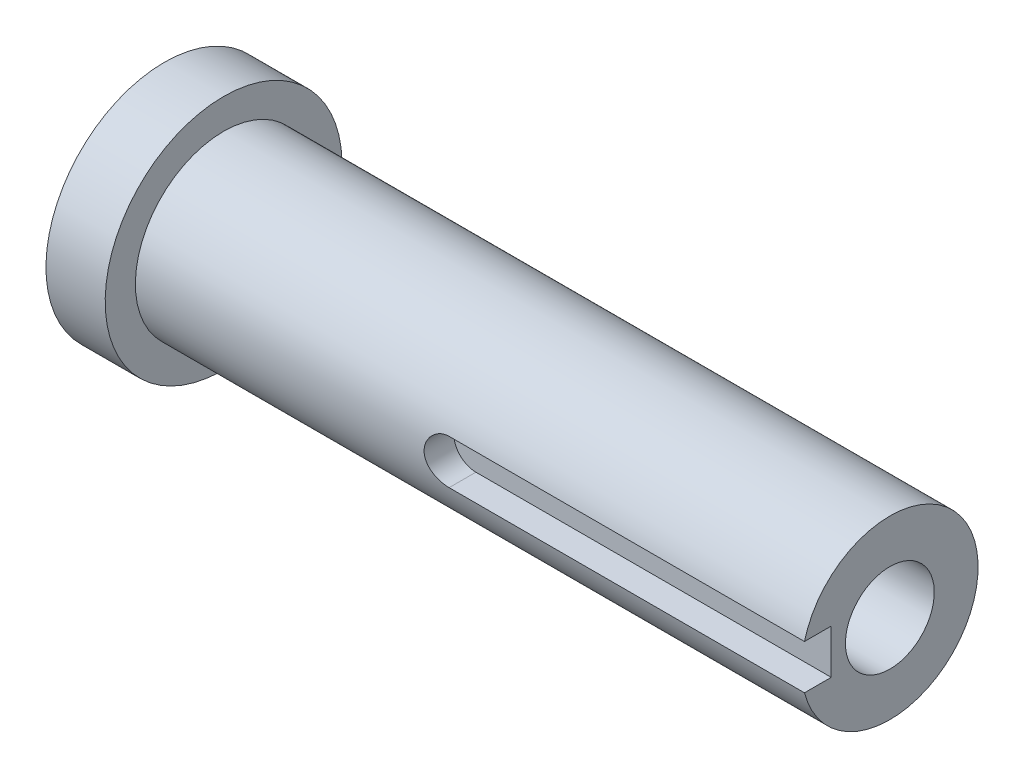
ISO-10303-21;
HEADER;
FILE_DESCRIPTION(('STEP AP214'),'2;1');
FILE_NAME('part.step','',(''),(''),'','','');
FILE_SCHEMA(('AUTOMOTIVE_DESIGN { 1 0 10303 214 1 1 1 1 }'));
ENDSEC;
DATA;
#1=APPLICATION_CONTEXT('core data for automotive mechanical design processes');
#2=APPLICATION_PROTOCOL_DEFINITION('international standard','automotive_design',2000,#1);
#3=PRODUCT_CONTEXT('',#1,'mechanical');
#4=PRODUCT('Part','Part','',(#3));
#5=PRODUCT_RELATED_PRODUCT_CATEGORY('part','',(#4));
#6=PRODUCT_DEFINITION_FORMATION('','',#4);
#7=PRODUCT_DEFINITION_CONTEXT('part definition',#1,'design');
#8=PRODUCT_DEFINITION('design','',#6,#7);
#9=PRODUCT_DEFINITION_SHAPE('','',#8);
#10=(LENGTH_UNIT() NAMED_UNIT(*) SI_UNIT(.MILLI.,.METRE.));
#11=(NAMED_UNIT(*) PLANE_ANGLE_UNIT() SI_UNIT($,.RADIAN.));
#12=(NAMED_UNIT(*) SI_UNIT($,.STERADIAN.) SOLID_ANGLE_UNIT());
#13=UNCERTAINTY_MEASURE_WITH_UNIT(LENGTH_MEASURE(1.E-05),#10,'distance_accuracy_value','');
#14=(GEOMETRIC_REPRESENTATION_CONTEXT(3) GLOBAL_UNCERTAINTY_ASSIGNED_CONTEXT((#13)) GLOBAL_UNIT_ASSIGNED_CONTEXT((#10,
#11,#12)) REPRESENTATION_CONTEXT('',''));
#15=CARTESIAN_POINT('',(0.,0.,0.));
#16=DIRECTION('',(0.,0.,1.));
#17=DIRECTION('',(1.,0.,0.));
#18=AXIS2_PLACEMENT_3D('',#15,#16,#17);
#19=CARTESIAN_POINT('',(155.575,0.,0.));
#20=DIRECTION('',(-1.,0.,0.));
#21=DIRECTION('',(0.,-1.,0.));
#22=AXIS2_PLACEMENT_3D('',#19,#20,#21);
#23=PLANE('',#22);
#24=CARTESIAN_POINT('',(155.575,0.,0.));
#25=DIRECTION('',(-1.,0.,0.));
#26=DIRECTION('',(0.,-1.,0.));
#27=AXIS2_PLACEMENT_3D('',#24,#25,#26);
#28=CIRCLE('',#27,9.525);
#29=CARTESIAN_POINT('',(155.575,-9.525,0.));
#30=VERTEX_POINT('',#29);
#31=EDGE_CURVE('E89',#30,#30,#28,.T.);
#32=ORIENTED_EDGE('',*,*,#31,.T.);
#33=EDGE_LOOP('',(#32));
#34=FACE_BOUND('',#33,.T.);
#35=CARTESIAN_POINT('',(155.575,0.,0.));
#36=DIRECTION('',(1.,0.,0.));
#37=DIRECTION('',(0.,1.,0.));
#38=AXIS2_PLACEMENT_3D('',#35,#36,#37);
#39=CIRCLE('',#38,18.923);
#40=CARTESIAN_POINT('',(155.575,-4.7625,18.3138887937543));
#41=VERTEX_POINT('',#40);
#42=CARTESIAN_POINT('',(155.575,4.7625,18.3138887937543));
#43=VERTEX_POINT('',#42);
#44=EDGE_CURVE('E112',#41,#43,#39,.T.);
#45=ORIENTED_EDGE('',*,*,#44,.T.);
#46=DIRECTION('',(0.,0.,1.));
#47=VECTOR('',#46,1.);
#48=CARTESIAN_POINT('',(155.575,4.7625,12.573));
#49=LINE('',#48,#47);
#50=CARTESIAN_POINT('',(155.575,4.7625,12.573));
#51=VERTEX_POINT('',#50);
#52=EDGE_CURVE('E54',#51,#43,#49,.T.);
#53=ORIENTED_EDGE('',*,*,#52,.F.);
#54=DIRECTION('',(0.,1.,0.));
#55=VECTOR('',#54,1.);
#56=CARTESIAN_POINT('',(155.575,0.,12.573));
#57=LINE('',#56,#55);
#58=CARTESIAN_POINT('',(155.575,-4.7625,12.573));
#59=VERTEX_POINT('',#58);
#60=EDGE_CURVE('E76',#59,#51,#57,.T.);
#61=ORIENTED_EDGE('',*,*,#60,.F.);
#62=DIRECTION('',(0.,0.,1.));
#63=VECTOR('',#62,1.);
#64=CARTESIAN_POINT('',(155.575,-4.7625,12.573));
#65=LINE('',#64,#63);
#66=EDGE_CURVE('E100',#59,#41,#65,.T.);
#67=ORIENTED_EDGE('',*,*,#66,.T.);
#68=EDGE_LOOP('',(#45,#53,#61,#67));
#69=FACE_BOUND('',#68,.T.);
#70=ADVANCED_FACE('F33',(#34,#69),#23,.F.);
#71=CARTESIAN_POINT('',(155.575,0.,0.));
#72=DIRECTION('',(1.,0.,0.));
#73=DIRECTION('',(0.,1.,0.));
#74=AXIS2_PLACEMENT_3D('',#71,#72,#73);
#75=CYLINDRICAL_SURFACE('',#74,18.923);
#76=ORIENTED_EDGE('',*,*,#44,.F.);
#77=DIRECTION('',(1.,0.,0.));
#78=VECTOR('',#77,1.);
#79=CARTESIAN_POINT('',(155.575,-4.7625,18.3138887937543));
#80=LINE('',#79,#78);
#81=CARTESIAN_POINT('',(79.375,-4.7625,18.3138887937543));
#82=VERTEX_POINT('',#81);
#83=EDGE_CURVE('E11',#41,#82,#80,.F.);
#84=ORIENTED_EDGE('',*,*,#83,.T.);
#85=CARTESIAN_POINT('',(79.375,-4.76249999999999,18.3138887937543));
#86=CARTESIAN_POINT('',(79.2433253399544,-4.76251660953841,18.3138735198742));
#87=CARTESIAN_POINT('',(79.1116562639847,-4.75703984298783,18.315308376362));
#88=CARTESIAN_POINT('',(78.8493033078918,-4.7352222803292,18.3209670322005));
#89=CARTESIAN_POINT('',(78.7186192641357,-4.71888333074368,18.3251903575232));
#90=CARTESIAN_POINT('',(78.4594234852744,-4.67550730551678,18.3363036204371));
#91=CARTESIAN_POINT('',(78.3309079405726,-4.64849161137564,18.3431882278825));
#92=CARTESIAN_POINT('',(78.076691696416,-4.5839937278702,18.3594129125112));
#93=CARTESIAN_POINT('',(77.9509910367392,-4.54651139069975,18.36875302437));
#94=CARTESIAN_POINT('',(77.7033035049315,-4.46138696138009,18.3896131428181));
#95=CARTESIAN_POINT('',(77.5813154496881,-4.41374814541657,18.4011324463287));
#96=CARTESIAN_POINT('',(77.3418131199602,-4.30867583391744,18.4260183520056));
#97=CARTESIAN_POINT('',(77.2243005247203,-4.2512387053796,18.4393856390144));
#98=CARTESIAN_POINT('',(76.8796835255389,-4.06483399601563,18.4817023915795));
#99=CARTESIAN_POINT('',(76.6603053165467,-3.92170589047419,18.512884042943));
#100=CARTESIAN_POINT('',(76.2441312062197,-3.59860285208654,18.578417897233));
#101=CARTESIAN_POINT('',(76.0478734797117,-3.41794944790432,18.6128209634746));
#102=CARTESIAN_POINT('',(75.6880520179443,-3.02630255410582,18.6804938814371));
#103=CARTESIAN_POINT('',(75.5244935162015,-2.81530421705436,18.7137635510519));
#104=CARTESIAN_POINT('',(75.232564687448,-2.36528653288353,18.7759844260401));
#105=CARTESIAN_POINT('',(75.1047248459275,-2.12591303215542,18.8048678869623));
#106=CARTESIAN_POINT('',(74.8913051234453,-1.6282358350461,18.8544746769497));
#107=CARTESIAN_POINT('',(74.8057168473054,-1.36993591097513,18.8751996269049));
#108=CARTESIAN_POINT('',(74.6809523441367,-0.847350322058186,18.9057927906946));
#109=CARTESIAN_POINT('',(74.640860403285,-0.583296006356602,18.91587491284));
#110=CARTESIAN_POINT('',(74.605351178485,-0.0520233680600575,18.9247921703949));
#111=CARTESIAN_POINT('',(74.6099281921639,0.21519454632464,18.9236287413951));
#112=CARTESIAN_POINT('',(74.66296914539,0.738841473881623,18.9103449336913));
#113=CARTESIAN_POINT('',(74.7104436451267,0.99537796758441,18.898471592163));
#114=CARTESIAN_POINT('',(74.8463492802151,1.49672329086461,18.8653887418554));
#115=CARTESIAN_POINT('',(74.934782241488,1.7415315970645,18.8441788168549));
#116=CARTESIAN_POINT('',(75.1508579717833,2.21504533666325,18.7944346155068));
#117=CARTESIAN_POINT('',(75.2788518524899,2.44358307199934,18.7658351440016));
#118=CARTESIAN_POINT('',(75.5702754338417,2.87636385828388,18.7043914457931));
#119=CARTESIAN_POINT('',(75.7337105585247,3.0806031831108,18.6715465696711));
#120=CARTESIAN_POINT('',(76.0044309407375,3.3672924881473,18.6212539254967));
#121=CARTESIAN_POINT('',(76.1004227587243,3.46070685098405,18.6040777010605));
#122=CARTESIAN_POINT('',(76.2999454480142,3.63913829584238,18.5699981436094));
#123=CARTESIAN_POINT('',(76.403473651298,3.7241583247378,18.5530947165834));
#124=CARTESIAN_POINT('',(76.617464906083,3.88527529448158,18.5200254113694));
#125=CARTESIAN_POINT('',(76.7279324789727,3.96136632303104,18.5038600261515));
#126=CARTESIAN_POINT('',(76.9549739518181,4.10400333780815,18.4727478257863));
#127=CARTESIAN_POINT('',(77.0715454702009,4.17055300945085,18.4578005411073));
#128=CARTESIAN_POINT('',(77.31075893862,4.29401200365562,18.4294717261372));
#129=CARTESIAN_POINT('',(77.4334328203324,4.35086174476138,18.4161000187523));
#130=CARTESIAN_POINT('',(77.683301993289,4.45396699231819,18.3914359883254));
#131=CARTESIAN_POINT('',(77.8104954551167,4.50022673016398,18.3801428351208));
#132=CARTESIAN_POINT('',(78.0683994223666,4.58175435296052,18.359989657861));
#133=CARTESIAN_POINT('',(78.1991061320565,4.61703362065529,18.3511271152895));
#134=CARTESIAN_POINT('',(78.4631443346959,4.67634719004762,18.3361021220348));
#135=CARTESIAN_POINT('',(78.5964745680448,4.70038675716735,18.3299384071277));
#136=CARTESIAN_POINT('',(78.837408307229,4.73328820895563,18.3214668017422));
#137=CARTESIAN_POINT('',(78.9447120659773,4.74424578443883,18.3186288636532));
#138=CARTESIAN_POINT('',(79.1596742272082,4.75884886541964,18.314838187983));
#139=CARTESIAN_POINT('',(79.2673317744972,4.76250617800084,18.3138824063288));
#140=CARTESIAN_POINT('',(79.375,4.76249999999999,18.3138887937543));
#141=B_SPLINE_CURVE_WITH_KNOTS('',3,(#85,#86,#87,#88,#89,#90,#91,#92,#93,#94,#95,#96,#97,#98,
#99,#100,#101,#102,#103,#104,#105,#106,#107,#108,#109,#110,#111,#112,#113,#114,#115,#116,#117,
#118,#119,#120,#121,#122,#123,#124,#125,#126,#127,#128,#129,#130,#131,#132,#133,#134,#135,#136,
#137,#138,#139,#140),.UNSPECIFIED.,.F.,.F.,(4,2,2,2,2,2,2,2,2,2,2,2,2,2,2,2,2,2,2,2,2,2,2,2,2,2,
2,4),(0.,0.394893686038787,0.789720259077887,1.18376011751773,1.57780554072691,1.97172404810093,
2.36578893065128,3.15330647048713,3.95654364784071,4.75990928070915,5.5746390007919,
6.38920677286362,7.1870714382894,7.98483425082284,8.76465342741085,9.54450737155134,
10.3314917052781,11.1185965666343,11.5233252150044,11.9279112723238,12.332763730703,
12.7374593882784,13.1445577613388,13.5514931871136,13.958005353302,14.3643268909114,
14.6877683518331,15.0106862693152),.UNSPECIFIED.);
#142=CARTESIAN_POINT('',(79.375,4.76249999999999,18.3138887937543));
#143=VERTEX_POINT('',#142);
#144=EDGE_CURVE('E115',#82,#143,#141,.T.);
#145=ORIENTED_EDGE('',*,*,#144,.T.);
#146=DIRECTION('',(1.,0.,0.));
#147=VECTOR('',#146,1.);
#148=CARTESIAN_POINT('',(155.575,4.7625,18.3138887937543));
#149=LINE('',#148,#147);
#150=EDGE_CURVE('E40',#143,#43,#149,.T.);
#151=ORIENTED_EDGE('',*,*,#150,.T.);
#152=EDGE_LOOP('',(#76,#84,#145,#151));
#153=FACE_BOUND('',#152,.T.);
#154=CARTESIAN_POINT('',(12.7,0.,0.));
#155=DIRECTION('',(1.,0.,0.));
#156=DIRECTION('',(0.,1.,0.));
#157=AXIS2_PLACEMENT_3D('',#154,#155,#156);
#158=CIRCLE('',#157,18.923);
#159=CARTESIAN_POINT('',(12.7,18.923,0.));
#160=VERTEX_POINT('',#159);
#161=EDGE_CURVE('E109',#160,#160,#158,.T.);
#162=ORIENTED_EDGE('',*,*,#161,.T.);
#163=EDGE_LOOP('',(#162));
#164=FACE_BOUND('',#163,.T.);
#165=ADVANCED_FACE('F121',(#153,#164),#75,.T.);
#166=CARTESIAN_POINT('',(12.7,0.,0.));
#167=DIRECTION('',(-1.,0.,0.));
#168=DIRECTION('',(0.,-1.,0.));
#169=AXIS2_PLACEMENT_3D('',#166,#167,#168);
#170=PLANE('',#169);
#171=ORIENTED_EDGE('',*,*,#161,.F.);
#172=EDGE_LOOP('',(#171));
#173=FACE_BOUND('',#172,.T.);
#174=CARTESIAN_POINT('',(12.7,0.,0.));
#175=DIRECTION('',(1.,0.,0.));
#176=DIRECTION('',(0.,1.,0.));
#177=AXIS2_PLACEMENT_3D('',#174,#175,#176);
#178=CIRCLE('',#177,25.4);
#179=CARTESIAN_POINT('',(12.7,25.4,0.));
#180=VERTEX_POINT('',#179);
#181=EDGE_CURVE('E106',#180,#180,#178,.T.);
#182=ORIENTED_EDGE('',*,*,#181,.T.);
#183=EDGE_LOOP('',(#182));
#184=FACE_BOUND('',#183,.T.);
#185=ADVANCED_FACE('F138',(#173,#184),#170,.F.);
#186=CARTESIAN_POINT('',(155.575,0.,0.));
#187=DIRECTION('',(1.,0.,0.));
#188=DIRECTION('',(0.,1.,0.));
#189=AXIS2_PLACEMENT_3D('',#186,#187,#188);
#190=CYLINDRICAL_SURFACE('',#189,25.4);
#191=ORIENTED_EDGE('',*,*,#181,.F.);
#192=EDGE_LOOP('',(#191));
#193=FACE_BOUND('',#192,.T.);
#194=CARTESIAN_POINT('',(0.,0.,0.));
#195=DIRECTION('',(1.,0.,0.));
#196=DIRECTION('',(0.,1.,0.));
#197=AXIS2_PLACEMENT_3D('',#194,#195,#196);
#198=CIRCLE('',#197,25.4);
#199=CARTESIAN_POINT('',(0.,25.4,0.));
#200=VERTEX_POINT('',#199);
#201=EDGE_CURVE('E99',#200,#200,#198,.T.);
#202=ORIENTED_EDGE('',*,*,#201,.T.);
#203=EDGE_LOOP('',(#202));
#204=FACE_BOUND('',#203,.T.);
#205=ADVANCED_FACE('F135',(#193,#204),#190,.T.);
#206=CARTESIAN_POINT('',(0.,0.,0.));
#207=DIRECTION('',(1.,0.,0.));
#208=DIRECTION('',(0.,1.,0.));
#209=AXIS2_PLACEMENT_3D('',#206,#207,#208);
#210=PLANE('',#209);
#211=CARTESIAN_POINT('',(0.,0.,0.));
#212=DIRECTION('',(-1.,0.,0.));
#213=DIRECTION('',(0.,-1.,0.));
#214=AXIS2_PLACEMENT_3D('',#211,#212,#213);
#215=CIRCLE('',#214,9.525);
#216=CARTESIAN_POINT('',(0.,-9.525,0.));
#217=VERTEX_POINT('',#216);
#218=EDGE_CURVE('E92',#217,#217,#215,.T.);
#219=ORIENTED_EDGE('',*,*,#218,.F.);
#220=EDGE_LOOP('',(#219));
#221=FACE_BOUND('',#220,.T.);
#222=ORIENTED_EDGE('',*,*,#201,.F.);
#223=EDGE_LOOP('',(#222));
#224=FACE_BOUND('',#223,.T.);
#225=ADVANCED_FACE('F132',(#221,#224),#210,.F.);
#226=CARTESIAN_POINT('',(0.,4.76249999999998,12.573));
#227=DIRECTION('',(0.,1.,0.));
#228=DIRECTION('',(-1.,0.,0.));
#229=AXIS2_PLACEMENT_3D('',#226,#227,#228);
#230=PLANE('',#229);
#231=DIRECTION('',(0.,0.,1.));
#232=VECTOR('',#231,1.);
#233=CARTESIAN_POINT('',(79.375,4.76249999999999,12.573));
#234=LINE('',#233,#232);
#235=CARTESIAN_POINT('',(79.375,4.76249999999999,12.573));
#236=VERTEX_POINT('',#235);
#237=EDGE_CURVE('E47',#236,#143,#234,.T.);
#238=ORIENTED_EDGE('',*,*,#237,.F.);
#239=DIRECTION('',(-1.,0.,0.));
#240=VECTOR('',#239,1.);
#241=CARTESIAN_POINT('',(0.,4.76249999999998,12.573));
#242=LINE('',#241,#240);
#243=EDGE_CURVE('E72',#51,#236,#242,.T.);
#244=ORIENTED_EDGE('',*,*,#243,.F.);
#245=ORIENTED_EDGE('',*,*,#52,.T.);
#246=ORIENTED_EDGE('',*,*,#150,.F.);
#247=EDGE_LOOP('',(#238,#244,#245,#246));
#248=FACE_BOUND('',#247,.T.);
#249=ADVANCED_FACE('F70',(#248),#230,.F.);
#250=CARTESIAN_POINT('',(0.,-4.7625,12.573));
#251=DIRECTION('',(0.,-1.,0.));
#252=DIRECTION('',(0.,0.,-1.));
#253=AXIS2_PLACEMENT_3D('',#250,#251,#252);
#254=PLANE('',#253);
#255=ORIENTED_EDGE('',*,*,#66,.F.);
#256=DIRECTION('',(1.,0.,0.));
#257=VECTOR('',#256,1.);
#258=CARTESIAN_POINT('',(0.,-4.7625,12.573));
#259=LINE('',#258,#257);
#260=CARTESIAN_POINT('',(79.375,-4.7625,12.573));
#261=VERTEX_POINT('',#260);
#262=EDGE_CURVE('E85',#261,#59,#259,.T.);
#263=ORIENTED_EDGE('',*,*,#262,.F.);
#264=DIRECTION('',(0.,0.,1.));
#265=VECTOR('',#264,1.);
#266=CARTESIAN_POINT('',(79.375,-4.7625,12.573));
#267=LINE('',#266,#265);
#268=EDGE_CURVE('E75',#261,#82,#267,.T.);
#269=ORIENTED_EDGE('',*,*,#268,.T.);
#270=ORIENTED_EDGE('',*,*,#83,.F.);
#271=EDGE_LOOP('',(#255,#263,#269,#270));
#272=FACE_BOUND('',#271,.T.);
#273=ADVANCED_FACE('F128',(#272),#254,.F.);
#274=CARTESIAN_POINT('',(79.375,0.,12.573));
#275=DIRECTION('',(0.,0.,1.));
#276=DIRECTION('',(1.,0.,0.));
#277=AXIS2_PLACEMENT_3D('',#274,#275,#276);
#278=CYLINDRICAL_SURFACE('',#277,4.76249999999999);
#279=ORIENTED_EDGE('',*,*,#268,.F.);
#280=CARTESIAN_POINT('',(79.375,0.,12.573));
#281=DIRECTION('',(0.,0.,1.));
#282=DIRECTION('',(1.,0.,0.));
#283=AXIS2_PLACEMENT_3D('',#280,#281,#282);
#284=CIRCLE('',#283,4.76249999999999);
#285=EDGE_CURVE('E79',#236,#261,#284,.T.);
#286=ORIENTED_EDGE('',*,*,#285,.F.);
#287=ORIENTED_EDGE('',*,*,#237,.T.);
#288=ORIENTED_EDGE('',*,*,#144,.F.);
#289=EDGE_LOOP('',(#279,#286,#287,#288));
#290=FACE_BOUND('',#289,.T.);
#291=ADVANCED_FACE('F80',(#290),#278,.F.);
#292=CARTESIAN_POINT('',(0.,0.,12.573));
#293=DIRECTION('',(0.,0.,1.));
#294=DIRECTION('',(1.,0.,0.));
#295=AXIS2_PLACEMENT_3D('',#292,#293,#294);
#296=PLANE('',#295);
#297=ORIENTED_EDGE('',*,*,#243,.T.);
#298=ORIENTED_EDGE('',*,*,#285,.T.);
#299=ORIENTED_EDGE('',*,*,#262,.T.);
#300=ORIENTED_EDGE('',*,*,#60,.T.);
#301=EDGE_LOOP('',(#297,#298,#299,#300));
#302=FACE_BOUND('',#301,.T.);
#303=ADVANCED_FACE('F87',(#302),#296,.T.);
#304=CARTESIAN_POINT('',(155.575,0.,0.));
#305=DIRECTION('',(-1.,0.,0.));
#306=DIRECTION('',(0.,-1.,0.));
#307=AXIS2_PLACEMENT_3D('',#304,#305,#306);
#308=CYLINDRICAL_SURFACE('',#307,9.525);
#309=ORIENTED_EDGE('',*,*,#31,.F.);
#310=EDGE_LOOP('',(#309));
#311=FACE_BOUND('',#310,.T.);
#312=ORIENTED_EDGE('',*,*,#218,.T.);
#313=EDGE_LOOP('',(#312));
#314=FACE_BOUND('',#313,.T.);
#315=ADVANCED_FACE('F172',(#311,#314),#308,.F.);
#316=CLOSED_SHELL('',(#70,#165,#185,#205,#225,#249,#273,#291,#303,#315));
#317=MANIFOLD_SOLID_BREP('B2',#316);
#318=ADVANCED_BREP_SHAPE_REPRESENTATION('',(#18,#317),#14);
#319=SHAPE_DEFINITION_REPRESENTATION(#9,#318);
ENDSEC;
END-ISO-10303-21;
